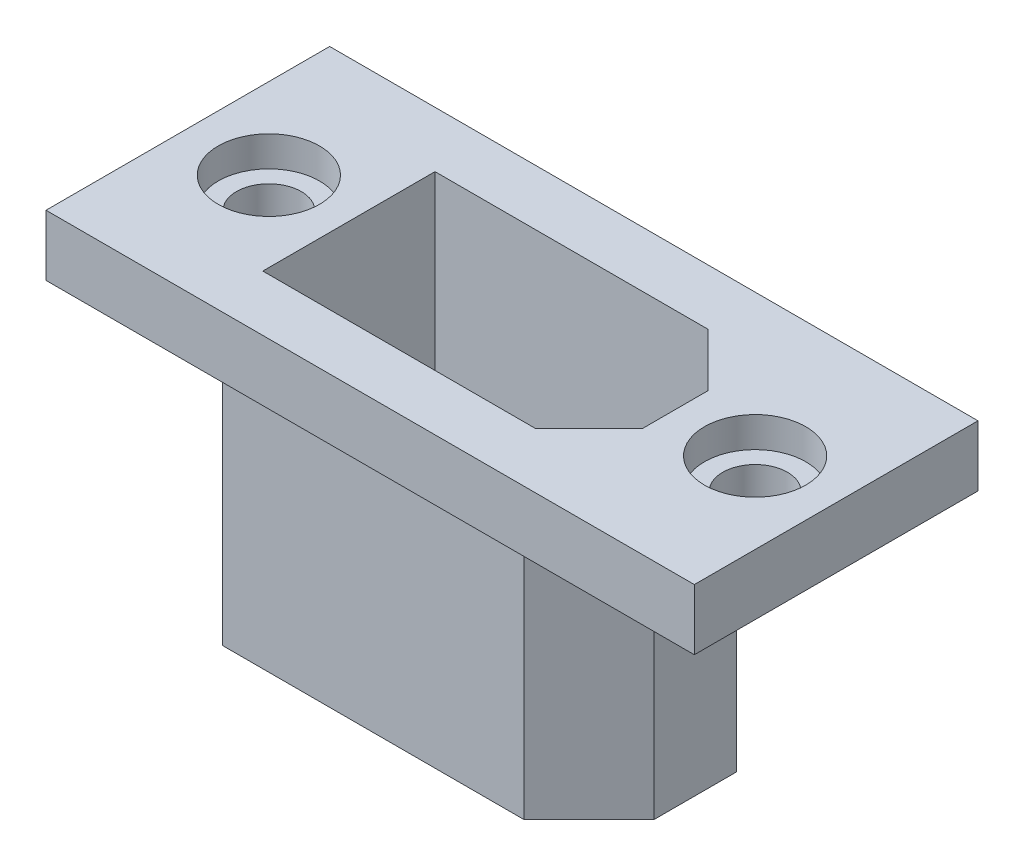
ISO-10303-21;
HEADER;
FILE_DESCRIPTION(('STEP AP214'),'2;1');
FILE_NAME('part.step','',(''),(''),'','','');
FILE_SCHEMA(('AUTOMOTIVE_DESIGN { 1 0 10303 214 1 1 1 1 }'));
ENDSEC;
DATA;
#1=APPLICATION_CONTEXT('core data for automotive mechanical design processes');
#2=APPLICATION_PROTOCOL_DEFINITION('international standard','automotive_design',2000,#1);
#3=PRODUCT_CONTEXT('',#1,'mechanical');
#4=PRODUCT('Part','Part','',(#3));
#5=PRODUCT_RELATED_PRODUCT_CATEGORY('part','',(#4));
#6=PRODUCT_DEFINITION_FORMATION('','',#4);
#7=PRODUCT_DEFINITION_CONTEXT('part definition',#1,'design');
#8=PRODUCT_DEFINITION('design','',#6,#7);
#9=PRODUCT_DEFINITION_SHAPE('','',#8);
#10=(LENGTH_UNIT() NAMED_UNIT(*) SI_UNIT(.MILLI.,.METRE.));
#11=(NAMED_UNIT(*) PLANE_ANGLE_UNIT() SI_UNIT($,.RADIAN.));
#12=(NAMED_UNIT(*) SI_UNIT($,.STERADIAN.) SOLID_ANGLE_UNIT());
#13=UNCERTAINTY_MEASURE_WITH_UNIT(LENGTH_MEASURE(1.E-05),#10,'distance_accuracy_value','');
#14=(GEOMETRIC_REPRESENTATION_CONTEXT(3) GLOBAL_UNCERTAINTY_ASSIGNED_CONTEXT((#13)) GLOBAL_UNIT_ASSIGNED_CONTEXT((#10,
#11,#12)) REPRESENTATION_CONTEXT('',''));
#15=CARTESIAN_POINT('',(0.,0.,0.));
#16=DIRECTION('',(0.,0.,1.));
#17=DIRECTION('',(1.,0.,0.));
#18=AXIS2_PLACEMENT_3D('',#15,#16,#17);
#19=CARTESIAN_POINT('',(12.,0.,0.));
#20=DIRECTION('',(0.,1.,0.));
#21=DIRECTION('',(0.,0.,1.));
#22=AXIS2_PLACEMENT_3D('',#19,#20,#21);
#23=CYLINDRICAL_SURFACE('',#22,1.6);
#24=CARTESIAN_POINT('',(12.,0.,0.));
#25=DIRECTION('',(0.,1.,0.));
#26=DIRECTION('',(0.,0.,1.));
#27=AXIS2_PLACEMENT_3D('',#24,#25,#26);
#28=CIRCLE('',#27,1.6);
#29=CARTESIAN_POINT('',(12.,0.,1.6));
#30=VERTEX_POINT('',#29);
#31=EDGE_CURVE('E177',#30,#30,#28,.T.);
#32=ORIENTED_EDGE('',*,*,#31,.F.);
#33=EDGE_LOOP('',(#32));
#34=FACE_BOUND('',#33,.T.);
#35=CARTESIAN_POINT('',(12.,1.5,0.));
#36=DIRECTION('',(0.,1.,0.));
#37=DIRECTION('',(0.,0.,1.));
#38=AXIS2_PLACEMENT_3D('',#35,#36,#37);
#39=CIRCLE('',#38,1.6);
#40=CARTESIAN_POINT('',(12.,1.5,1.6));
#41=VERTEX_POINT('',#40);
#42=EDGE_CURVE('E38',#41,#41,#39,.F.);
#43=ORIENTED_EDGE('',*,*,#42,.F.);
#44=EDGE_LOOP('',(#43));
#45=FACE_BOUND('',#44,.T.);
#46=ADVANCED_FACE('F34',(#34,#45),#23,.F.);
#47=CARTESIAN_POINT('',(-12.,0.,0.));
#48=DIRECTION('',(0.,1.,0.));
#49=DIRECTION('',(0.,0.,1.));
#50=AXIS2_PLACEMENT_3D('',#47,#48,#49);
#51=CYLINDRICAL_SURFACE('',#50,1.6);
#52=CARTESIAN_POINT('',(-12.,0.,0.));
#53=DIRECTION('',(0.,1.,0.));
#54=DIRECTION('',(0.,0.,1.));
#55=AXIS2_PLACEMENT_3D('',#52,#53,#54);
#56=CIRCLE('',#55,1.6);
#57=CARTESIAN_POINT('',(-12.,0.,1.6));
#58=VERTEX_POINT('',#57);
#59=EDGE_CURVE('E174',#58,#58,#56,.T.);
#60=ORIENTED_EDGE('',*,*,#59,.F.);
#61=EDGE_LOOP('',(#60));
#62=FACE_BOUND('',#61,.T.);
#63=CARTESIAN_POINT('',(-12.,1.5,0.));
#64=DIRECTION('',(0.,1.,0.));
#65=DIRECTION('',(0.,0.,1.));
#66=AXIS2_PLACEMENT_3D('',#63,#64,#65);
#67=CIRCLE('',#66,1.6);
#68=CARTESIAN_POINT('',(-12.,1.5,1.6));
#69=VERTEX_POINT('',#68);
#70=EDGE_CURVE('E285',#69,#69,#67,.F.);
#71=ORIENTED_EDGE('',*,*,#70,.F.);
#72=EDGE_LOOP('',(#71));
#73=FACE_BOUND('',#72,.T.);
#74=ADVANCED_FACE('F341',(#62,#73),#51,.F.);
#75=CARTESIAN_POINT('',(16.,3.,-7.));
#76=DIRECTION('',(-1.,0.,0.));
#77=DIRECTION('',(0.,0.,1.));
#78=AXIS2_PLACEMENT_3D('',#75,#76,#77);
#79=PLANE('',#78);
#80=DIRECTION('',(0.,0.,-1.));
#81=VECTOR('',#80,1.);
#82=CARTESIAN_POINT('',(16.,0.,-7.));
#83=LINE('',#82,#81);
#84=CARTESIAN_POINT('',(16.,0.,7.));
#85=VERTEX_POINT('',#84);
#86=CARTESIAN_POINT('',(16.,0.,-7.));
#87=VERTEX_POINT('',#86);
#88=EDGE_CURVE('E157',#85,#87,#83,.T.);
#89=ORIENTED_EDGE('',*,*,#88,.T.);
#90=DIRECTION('',(0.,-1.,0.));
#91=VECTOR('',#90,1.);
#92=CARTESIAN_POINT('',(16.,3.,-7.));
#93=LINE('',#92,#91);
#94=CARTESIAN_POINT('',(16.,3.,-7.));
#95=VERTEX_POINT('',#94);
#96=EDGE_CURVE('E269',#95,#87,#93,.T.);
#97=ORIENTED_EDGE('',*,*,#96,.F.);
#98=DIRECTION('',(0.,0.,-1.));
#99=VECTOR('',#98,1.);
#100=CARTESIAN_POINT('',(16.,3.,-7.));
#101=LINE('',#100,#99);
#102=CARTESIAN_POINT('',(16.,3.,7.));
#103=VERTEX_POINT('',#102);
#104=EDGE_CURVE('E243',#103,#95,#101,.T.);
#105=ORIENTED_EDGE('',*,*,#104,.F.);
#106=DIRECTION('',(0.,-1.,0.));
#107=VECTOR('',#106,1.);
#108=CARTESIAN_POINT('',(16.,3.,7.));
#109=LINE('',#108,#107);
#110=EDGE_CURVE('E253',#103,#85,#109,.T.);
#111=ORIENTED_EDGE('',*,*,#110,.T.);
#112=EDGE_LOOP('',(#89,#97,#105,#111));
#113=FACE_BOUND('',#112,.T.);
#114=ADVANCED_FACE('F36',(#113),#79,.F.);
#115=CARTESIAN_POINT('',(-16.,3.,-7.));
#116=DIRECTION('',(0.,0.,1.));
#117=DIRECTION('',(1.,0.,0.));
#118=AXIS2_PLACEMENT_3D('',#115,#116,#117);
#119=PLANE('',#118);
#120=DIRECTION('',(-1.,0.,0.));
#121=VECTOR('',#120,1.);
#122=CARTESIAN_POINT('',(-16.,0.,-7.));
#123=LINE('',#122,#121);
#124=CARTESIAN_POINT('',(-16.,0.,-7.));
#125=VERTEX_POINT('',#124);
#126=EDGE_CURVE('E256',#87,#125,#123,.T.);
#127=ORIENTED_EDGE('',*,*,#126,.T.);
#128=DIRECTION('',(0.,-1.,0.));
#129=VECTOR('',#128,1.);
#130=CARTESIAN_POINT('',(-16.,3.,-7.));
#131=LINE('',#130,#129);
#132=CARTESIAN_POINT('',(-16.,3.,-7.));
#133=VERTEX_POINT('',#132);
#134=EDGE_CURVE('E266',#133,#125,#131,.T.);
#135=ORIENTED_EDGE('',*,*,#134,.F.);
#136=DIRECTION('',(-1.,0.,0.));
#137=VECTOR('',#136,1.);
#138=CARTESIAN_POINT('',(-16.,3.,-7.));
#139=LINE('',#138,#137);
#140=EDGE_CURVE('E246',#95,#133,#139,.T.);
#141=ORIENTED_EDGE('',*,*,#140,.F.);
#142=ORIENTED_EDGE('',*,*,#96,.T.);
#143=EDGE_LOOP('',(#127,#135,#141,#142));
#144=FACE_BOUND('',#143,.T.);
#145=ADVANCED_FACE('F406',(#144),#119,.F.);
#146=CARTESIAN_POINT('',(-16.,3.,-7.));
#147=DIRECTION('',(1.,0.,0.));
#148=DIRECTION('',(0.,0.,-1.));
#149=AXIS2_PLACEMENT_3D('',#146,#147,#148);
#150=PLANE('',#149);
#151=DIRECTION('',(0.,0.,1.));
#152=VECTOR('',#151,1.);
#153=CARTESIAN_POINT('',(-16.,0.,-7.));
#154=LINE('',#153,#152);
#155=CARTESIAN_POINT('',(-16.,0.,7.));
#156=VERTEX_POINT('',#155);
#157=EDGE_CURVE('E258',#125,#156,#154,.T.);
#158=ORIENTED_EDGE('',*,*,#157,.T.);
#159=DIRECTION('',(0.,-1.,0.));
#160=VECTOR('',#159,1.);
#161=CARTESIAN_POINT('',(-16.,3.,7.));
#162=LINE('',#161,#160);
#163=CARTESIAN_POINT('',(-16.,3.,7.));
#164=VERTEX_POINT('',#163);
#165=EDGE_CURVE('E263',#164,#156,#162,.T.);
#166=ORIENTED_EDGE('',*,*,#165,.F.);
#167=DIRECTION('',(0.,0.,1.));
#168=VECTOR('',#167,1.);
#169=CARTESIAN_POINT('',(-16.,3.,-7.));
#170=LINE('',#169,#168);
#171=EDGE_CURVE('E249',#133,#164,#170,.T.);
#172=ORIENTED_EDGE('',*,*,#171,.F.);
#173=ORIENTED_EDGE('',*,*,#134,.T.);
#174=EDGE_LOOP('',(#158,#166,#172,#173));
#175=FACE_BOUND('',#174,.T.);
#176=ADVANCED_FACE('F403',(#175),#150,.F.);
#177=CARTESIAN_POINT('',(-16.,3.,7.));
#178=DIRECTION('',(0.,0.,-1.));
#179=DIRECTION('',(-1.,0.,0.));
#180=AXIS2_PLACEMENT_3D('',#177,#178,#179);
#181=PLANE('',#180);
#182=DIRECTION('',(1.,0.,0.));
#183=VECTOR('',#182,1.);
#184=CARTESIAN_POINT('',(-16.,0.,7.));
#185=LINE('',#184,#183);
#186=EDGE_CURVE('E247',#156,#85,#185,.T.);
#187=ORIENTED_EDGE('',*,*,#186,.T.);
#188=ORIENTED_EDGE('',*,*,#110,.F.);
#189=DIRECTION('',(1.,0.,0.));
#190=VECTOR('',#189,1.);
#191=CARTESIAN_POINT('',(-16.,3.,7.));
#192=LINE('',#191,#190);
#193=EDGE_CURVE('E251',#164,#103,#192,.T.);
#194=ORIENTED_EDGE('',*,*,#193,.F.);
#195=ORIENTED_EDGE('',*,*,#165,.T.);
#196=EDGE_LOOP('',(#187,#188,#194,#195));
#197=FACE_BOUND('',#196,.T.);
#198=ADVANCED_FACE('F312',(#197),#181,.F.);
#199=CARTESIAN_POINT('',(0.,3.,0.));
#200=DIRECTION('',(0.,1.,0.));
#201=DIRECTION('',(0.,0.,1.));
#202=AXIS2_PLACEMENT_3D('',#199,#200,#201);
#203=PLANE('',#202);
#204=CARTESIAN_POINT('',(-12.,3.,0.));
#205=DIRECTION('',(0.,1.,0.));
#206=DIRECTION('',(0.,0.,1.));
#207=AXIS2_PLACEMENT_3D('',#204,#205,#206);
#208=CIRCLE('',#207,2.5);
#209=CARTESIAN_POINT('',(-12.,3.,2.5));
#210=VERTEX_POINT('',#209);
#211=EDGE_CURVE('E292',#210,#210,#208,.T.);
#212=ORIENTED_EDGE('',*,*,#211,.F.);
#213=EDGE_LOOP('',(#212));
#214=FACE_BOUND('',#213,.T.);
#215=CARTESIAN_POINT('',(12.,3.,0.));
#216=DIRECTION('',(0.,1.,0.));
#217=DIRECTION('',(0.,0.,1.));
#218=AXIS2_PLACEMENT_3D('',#215,#216,#217);
#219=CIRCLE('',#218,2.5);
#220=CARTESIAN_POINT('',(12.,3.,2.5));
#221=VERTEX_POINT('',#220);
#222=EDGE_CURVE('E302',#221,#221,#219,.T.);
#223=ORIENTED_EDGE('',*,*,#222,.F.);
#224=EDGE_LOOP('',(#223));
#225=FACE_BOUND('',#224,.T.);
#226=ORIENTED_EDGE('',*,*,#104,.T.);
#227=ORIENTED_EDGE('',*,*,#140,.T.);
#228=ORIENTED_EDGE('',*,*,#171,.T.);
#229=ORIENTED_EDGE('',*,*,#193,.T.);
#230=EDGE_LOOP('',(#226,#227,#228,#229));
#231=FACE_BOUND('',#230,.T.);
#232=DIRECTION('',(0.707106781186548,0.,-0.707106781186547));
#233=VECTOR('',#232,1.);
#234=CARTESIAN_POINT('',(8.04999999999992,3.,1.62426406871191));
#235=LINE('',#234,#233);
#236=CARTESIAN_POINT('',(5.42426406871184,3.,4.24999999999998));
#237=VERTEX_POINT('',#236);
#238=CARTESIAN_POINT('',(8.04999999999992,3.,1.62426406871191));
#239=VERTEX_POINT('',#238);
#240=EDGE_CURVE('E59',#237,#239,#235,.T.);
#241=ORIENTED_EDGE('',*,*,#240,.F.);
#242=DIRECTION('',(1.,0.,0.));
#243=VECTOR('',#242,1.);
#244=CARTESIAN_POINT('',(5.42426406871184,3.,4.24999999999998));
#245=LINE('',#244,#243);
#246=CARTESIAN_POINT('',(-8.05000000000008,3.,4.24999999999998));
#247=VERTEX_POINT('',#246);
#248=EDGE_CURVE('E156',#247,#237,#245,.T.);
#249=ORIENTED_EDGE('',*,*,#248,.F.);
#250=DIRECTION('',(0.,0.,1.));
#251=VECTOR('',#250,1.);
#252=CARTESIAN_POINT('',(-8.05000000000008,3.,4.24999999999998));
#253=LINE('',#252,#251);
#254=CARTESIAN_POINT('',(-8.05000000000008,3.,-4.25000000000002));
#255=VERTEX_POINT('',#254);
#256=EDGE_CURVE('E231',#255,#247,#253,.T.);
#257=ORIENTED_EDGE('',*,*,#256,.F.);
#258=DIRECTION('',(-1.,0.,0.));
#259=VECTOR('',#258,1.);
#260=CARTESIAN_POINT('',(-8.05000000000008,3.,-4.25000000000002));
#261=LINE('',#260,#259);
#262=CARTESIAN_POINT('',(5.42426406871185,3.,-4.25000000000002));
#263=VERTEX_POINT('',#262);
#264=EDGE_CURVE('E228',#263,#255,#261,.T.);
#265=ORIENTED_EDGE('',*,*,#264,.F.);
#266=DIRECTION('',(-0.707106781186547,0.,-0.707106781186548));
#267=VECTOR('',#266,1.);
#268=CARTESIAN_POINT('',(5.42426406871185,3.,-4.25000000000002));
#269=LINE('',#268,#267);
#270=CARTESIAN_POINT('',(8.04999999999992,3.,-1.62426406871195));
#271=VERTEX_POINT('',#270);
#272=EDGE_CURVE('E225',#271,#263,#269,.T.);
#273=ORIENTED_EDGE('',*,*,#272,.F.);
#274=DIRECTION('',(0.,0.,-1.));
#275=VECTOR('',#274,1.);
#276=CARTESIAN_POINT('',(8.04999999999992,3.,-1.62426406871195));
#277=LINE('',#276,#275);
#278=EDGE_CURVE('E222',#239,#271,#277,.T.);
#279=ORIENTED_EDGE('',*,*,#278,.F.);
#280=EDGE_LOOP('',(#241,#249,#257,#265,#273,#279));
#281=FACE_BOUND('',#280,.T.);
#282=ADVANCED_FACE('F308',(#214,#225,#231,#281),#203,.T.);
#283=CARTESIAN_POINT('',(0.,0.,0.));
#284=DIRECTION('',(0.,1.,0.));
#285=DIRECTION('',(0.,0.,1.));
#286=AXIS2_PLACEMENT_3D('',#283,#284,#285);
#287=PLANE('',#286);
#288=ORIENTED_EDGE('',*,*,#59,.T.);
#289=EDGE_LOOP('',(#288));
#290=FACE_BOUND('',#289,.T.);
#291=ORIENTED_EDGE('',*,*,#31,.T.);
#292=EDGE_LOOP('',(#291));
#293=FACE_BOUND('',#292,.T.);
#294=DIRECTION('',(1.,0.,0.));
#295=VECTOR('',#294,1.);
#296=CARTESIAN_POINT('',(0.,0.,5.24999999999998));
#297=LINE('',#296,#295);
#298=CARTESIAN_POINT('',(-9.05000000000009,0.,5.24999999999998));
#299=VERTEX_POINT('',#298);
#300=CARTESIAN_POINT('',(5.83847763108494,0.,5.24999999999998));
#301=VERTEX_POINT('',#300);
#302=EDGE_CURVE('E43',#299,#301,#297,.T.);
#303=ORIENTED_EDGE('',*,*,#302,.T.);
#304=DIRECTION('',(0.707106781186548,0.,-0.707106781186548));
#305=VECTOR('',#304,1.);
#306=CARTESIAN_POINT('',(5.54423881554246,0.,5.54423881554246));
#307=LINE('',#306,#305);
#308=CARTESIAN_POINT('',(9.04999999999992,0.,2.03847763108501));
#309=VERTEX_POINT('',#308);
#310=EDGE_CURVE('E11',#301,#309,#307,.T.);
#311=ORIENTED_EDGE('',*,*,#310,.T.);
#312=DIRECTION('',(0.,0.,-1.));
#313=VECTOR('',#312,1.);
#314=CARTESIAN_POINT('',(9.04999999999992,0.,0.));
#315=LINE('',#314,#313);
#316=CARTESIAN_POINT('',(9.04999999999992,0.,-2.03847763108504));
#317=VERTEX_POINT('',#316);
#318=EDGE_CURVE('E272',#309,#317,#315,.T.);
#319=ORIENTED_EDGE('',*,*,#318,.T.);
#320=DIRECTION('',(-0.707106781186548,0.,-0.707106781186548));
#321=VECTOR('',#320,1.);
#322=CARTESIAN_POINT('',(5.54423881554248,0.,-5.54423881554248));
#323=LINE('',#322,#321);
#324=CARTESIAN_POINT('',(5.83847763108494,0.,-5.25000000000002));
#325=VERTEX_POINT('',#324);
#326=EDGE_CURVE('E275',#317,#325,#323,.T.);
#327=ORIENTED_EDGE('',*,*,#326,.T.);
#328=DIRECTION('',(-1.,0.,0.));
#329=VECTOR('',#328,1.);
#330=CARTESIAN_POINT('',(0.,0.,-5.25000000000002));
#331=LINE('',#330,#329);
#332=CARTESIAN_POINT('',(-9.05000000000009,0.,-5.25000000000002));
#333=VERTEX_POINT('',#332);
#334=EDGE_CURVE('E278',#325,#333,#331,.T.);
#335=ORIENTED_EDGE('',*,*,#334,.T.);
#336=DIRECTION('',(0.,0.,1.));
#337=VECTOR('',#336,1.);
#338=CARTESIAN_POINT('',(-9.05000000000009,0.,0.));
#339=LINE('',#338,#337);
#340=EDGE_CURVE('E281',#333,#299,#339,.T.);
#341=ORIENTED_EDGE('',*,*,#340,.T.);
#342=EDGE_LOOP('',(#303,#311,#319,#327,#335,#341));
#343=FACE_BOUND('',#342,.T.);
#344=ORIENTED_EDGE('',*,*,#88,.F.);
#345=ORIENTED_EDGE('',*,*,#186,.F.);
#346=ORIENTED_EDGE('',*,*,#157,.F.);
#347=ORIENTED_EDGE('',*,*,#126,.F.);
#348=EDGE_LOOP('',(#344,#345,#346,#347));
#349=FACE_BOUND('',#348,.T.);
#350=ADVANCED_FACE('F311',(#290,#293,#343,#349),#287,.F.);
#351=CARTESIAN_POINT('',(8.04999999999992,0.,1.62426406871191));
#352=DIRECTION('',(0.707106781186547,0.,0.707106781186548));
#353=DIRECTION('',(0.707106781186548,0.,-0.707106781186547));
#354=AXIS2_PLACEMENT_3D('',#351,#352,#353);
#355=PLANE('',#354);
#356=ORIENTED_EDGE('',*,*,#240,.T.);
#357=DIRECTION('',(0.,1.,0.));
#358=VECTOR('',#357,1.);
#359=CARTESIAN_POINT('',(8.04999999999992,0.,1.62426406871191));
#360=LINE('',#359,#358);
#361=CARTESIAN_POINT('',(8.04999999999992,-13.,1.62426406871191));
#362=VERTEX_POINT('',#361);
#363=EDGE_CURVE('E163',#362,#239,#360,.T.);
#364=ORIENTED_EDGE('',*,*,#363,.F.);
#365=DIRECTION('',(0.707106781186548,0.,-0.707106781186547));
#366=VECTOR('',#365,1.);
#367=CARTESIAN_POINT('',(8.04999999999992,-13.,1.62426406871191));
#368=LINE('',#367,#366);
#369=CARTESIAN_POINT('',(5.42426406871184,-13.,4.24999999999998));
#370=VERTEX_POINT('',#369);
#371=EDGE_CURVE('E161',#370,#362,#368,.T.);
#372=ORIENTED_EDGE('',*,*,#371,.F.);
#373=DIRECTION('',(0.,1.,0.));
#374=VECTOR('',#373,1.);
#375=CARTESIAN_POINT('',(5.42426406871184,0.,4.24999999999998));
#376=LINE('',#375,#374);
#377=EDGE_CURVE('E149',#370,#237,#376,.T.);
#378=ORIENTED_EDGE('',*,*,#377,.T.);
#379=EDGE_LOOP('',(#356,#364,#372,#378));
#380=FACE_BOUND('',#379,.T.);
#381=ADVANCED_FACE('F162',(#380),#355,.F.);
#382=CARTESIAN_POINT('',(5.42426406871184,0.,4.24999999999998));
#383=DIRECTION('',(0.,0.,1.));
#384=DIRECTION('',(1.,0.,0.));
#385=AXIS2_PLACEMENT_3D('',#382,#383,#384);
#386=PLANE('',#385);
#387=ORIENTED_EDGE('',*,*,#248,.T.);
#388=ORIENTED_EDGE('',*,*,#377,.F.);
#389=DIRECTION('',(1.,0.,0.));
#390=VECTOR('',#389,1.);
#391=CARTESIAN_POINT('',(5.42426406871184,-13.,4.24999999999998));
#392=LINE('',#391,#390);
#393=CARTESIAN_POINT('',(-8.05000000000008,-13.,4.24999999999998));
#394=VERTEX_POINT('',#393);
#395=EDGE_CURVE('E153',#394,#370,#392,.T.);
#396=ORIENTED_EDGE('',*,*,#395,.F.);
#397=DIRECTION('',(0.,1.,0.));
#398=VECTOR('',#397,1.);
#399=CARTESIAN_POINT('',(-8.05000000000008,0.,4.24999999999998));
#400=LINE('',#399,#398);
#401=EDGE_CURVE('E158',#394,#247,#400,.T.);
#402=ORIENTED_EDGE('',*,*,#401,.T.);
#403=EDGE_LOOP('',(#387,#388,#396,#402));
#404=FACE_BOUND('',#403,.T.);
#405=ADVANCED_FACE('F151',(#404),#386,.F.);
#406=CARTESIAN_POINT('',(-8.05000000000008,0.,4.24999999999998));
#407=DIRECTION('',(-1.,0.,0.));
#408=DIRECTION('',(0.,0.,1.));
#409=AXIS2_PLACEMENT_3D('',#406,#407,#408);
#410=PLANE('',#409);
#411=ORIENTED_EDGE('',*,*,#256,.T.);
#412=ORIENTED_EDGE('',*,*,#401,.F.);
#413=DIRECTION('',(0.,0.,1.));
#414=VECTOR('',#413,1.);
#415=CARTESIAN_POINT('',(-8.05000000000008,-13.,4.24999999999998));
#416=LINE('',#415,#414);
#417=CARTESIAN_POINT('',(-8.05000000000008,-13.,-4.25000000000002));
#418=VERTEX_POINT('',#417);
#419=EDGE_CURVE('E173',#418,#394,#416,.T.);
#420=ORIENTED_EDGE('',*,*,#419,.F.);
#421=DIRECTION('',(0.,1.,0.));
#422=VECTOR('',#421,1.);
#423=CARTESIAN_POINT('',(-8.05000000000008,0.,-4.25000000000002));
#424=LINE('',#423,#422);
#425=EDGE_CURVE('E236',#418,#255,#424,.T.);
#426=ORIENTED_EDGE('',*,*,#425,.T.);
#427=EDGE_LOOP('',(#411,#412,#420,#426));
#428=FACE_BOUND('',#427,.T.);
#429=ADVANCED_FACE('F331',(#428),#410,.F.);
#430=CARTESIAN_POINT('',(-8.05000000000008,0.,-4.25000000000002));
#431=DIRECTION('',(0.,0.,-1.));
#432=DIRECTION('',(-1.,0.,0.));
#433=AXIS2_PLACEMENT_3D('',#430,#431,#432);
#434=PLANE('',#433);
#435=ORIENTED_EDGE('',*,*,#264,.T.);
#436=ORIENTED_EDGE('',*,*,#425,.F.);
#437=DIRECTION('',(-1.,0.,0.));
#438=VECTOR('',#437,1.);
#439=CARTESIAN_POINT('',(-8.05000000000008,-13.,-4.25000000000002));
#440=LINE('',#439,#438);
#441=CARTESIAN_POINT('',(5.42426406871185,-13.,-4.25000000000002));
#442=VERTEX_POINT('',#441);
#443=EDGE_CURVE('E185',#442,#418,#440,.T.);
#444=ORIENTED_EDGE('',*,*,#443,.F.);
#445=DIRECTION('',(0.,1.,0.));
#446=VECTOR('',#445,1.);
#447=CARTESIAN_POINT('',(5.42426406871185,0.,-4.25000000000002));
#448=LINE('',#447,#446);
#449=EDGE_CURVE('E238',#442,#263,#448,.T.);
#450=ORIENTED_EDGE('',*,*,#449,.T.);
#451=EDGE_LOOP('',(#435,#436,#444,#450));
#452=FACE_BOUND('',#451,.T.);
#453=ADVANCED_FACE('F329',(#452),#434,.F.);
#454=CARTESIAN_POINT('',(5.42426406871185,0.,-4.25000000000002));
#455=DIRECTION('',(0.707106781186548,0.,-0.707106781186547));
#456=DIRECTION('',(-0.707106781186547,0.,-0.707106781186548));
#457=AXIS2_PLACEMENT_3D('',#454,#455,#456);
#458=PLANE('',#457);
#459=ORIENTED_EDGE('',*,*,#272,.T.);
#460=ORIENTED_EDGE('',*,*,#449,.F.);
#461=DIRECTION('',(-0.707106781186547,0.,-0.707106781186548));
#462=VECTOR('',#461,1.);
#463=CARTESIAN_POINT('',(5.42426406871185,-13.,-4.25000000000002));
#464=LINE('',#463,#462);
#465=CARTESIAN_POINT('',(8.04999999999992,-13.,-1.62426406871195));
#466=VERTEX_POINT('',#465);
#467=EDGE_CURVE('E182',#466,#442,#464,.T.);
#468=ORIENTED_EDGE('',*,*,#467,.F.);
#469=DIRECTION('',(0.,1.,0.));
#470=VECTOR('',#469,1.);
#471=CARTESIAN_POINT('',(8.04999999999992,0.,-1.62426406871195));
#472=LINE('',#471,#470);
#473=EDGE_CURVE('E240',#466,#271,#472,.T.);
#474=ORIENTED_EDGE('',*,*,#473,.T.);
#475=EDGE_LOOP('',(#459,#460,#468,#474));
#476=FACE_BOUND('',#475,.T.);
#477=ADVANCED_FACE('F327',(#476),#458,.F.);
#478=CARTESIAN_POINT('',(8.04999999999992,0.,-1.62426406871195));
#479=DIRECTION('',(1.,0.,0.));
#480=DIRECTION('',(0.,0.,-1.));
#481=AXIS2_PLACEMENT_3D('',#478,#479,#480);
#482=PLANE('',#481);
#483=ORIENTED_EDGE('',*,*,#278,.T.);
#484=ORIENTED_EDGE('',*,*,#473,.F.);
#485=DIRECTION('',(0.,0.,-1.));
#486=VECTOR('',#485,1.);
#487=CARTESIAN_POINT('',(8.04999999999992,-13.,-1.62426406871195));
#488=LINE('',#487,#486);
#489=EDGE_CURVE('E167',#362,#466,#488,.T.);
#490=ORIENTED_EDGE('',*,*,#489,.F.);
#491=ORIENTED_EDGE('',*,*,#363,.T.);
#492=EDGE_LOOP('',(#483,#484,#490,#491));
#493=FACE_BOUND('',#492,.T.);
#494=ADVANCED_FACE('F323',(#493),#482,.F.);
#495=CARTESIAN_POINT('',(9.04999999999992,-13.,2.03847763108501));
#496=DIRECTION('',(0.707106781186547,0.,0.707106781186547));
#497=DIRECTION('',(0.707106781186548,0.,-0.707106781186548));
#498=AXIS2_PLACEMENT_3D('',#495,#496,#497);
#499=PLANE('',#498);
#500=ORIENTED_EDGE('',*,*,#310,.F.);
#501=DIRECTION('',(0.,1.,0.));
#502=VECTOR('',#501,1.);
#503=CARTESIAN_POINT('',(5.83847763108494,-13.,5.24999999999998));
#504=LINE('',#503,#502);
#505=CARTESIAN_POINT('',(5.83847763108494,-13.,5.24999999999998));
#506=VERTEX_POINT('',#505);
#507=EDGE_CURVE('E206',#506,#301,#504,.T.);
#508=ORIENTED_EDGE('',*,*,#507,.F.);
#509=DIRECTION('',(0.707106781186548,0.,-0.707106781186548));
#510=VECTOR('',#509,1.);
#511=CARTESIAN_POINT('',(9.04999999999992,-13.,2.03847763108501));
#512=LINE('',#511,#510);
#513=CARTESIAN_POINT('',(9.04999999999992,-13.,2.03847763108501));
#514=VERTEX_POINT('',#513);
#515=EDGE_CURVE('E188',#506,#514,#512,.T.);
#516=ORIENTED_EDGE('',*,*,#515,.T.);
#517=DIRECTION('',(0.,1.,0.));
#518=VECTOR('',#517,1.);
#519=CARTESIAN_POINT('',(9.04999999999992,-13.,2.03847763108501));
#520=LINE('',#519,#518);
#521=EDGE_CURVE('E205',#514,#309,#520,.T.);
#522=ORIENTED_EDGE('',*,*,#521,.T.);
#523=EDGE_LOOP('',(#500,#508,#516,#522));
#524=FACE_BOUND('',#523,.T.);
#525=ADVANCED_FACE('F361',(#524),#499,.T.);
#526=CARTESIAN_POINT('',(5.83847763108494,-13.,5.24999999999998));
#527=DIRECTION('',(0.,0.,1.));
#528=DIRECTION('',(1.,0.,0.));
#529=AXIS2_PLACEMENT_3D('',#526,#527,#528);
#530=PLANE('',#529);
#531=ORIENTED_EDGE('',*,*,#302,.F.);
#532=DIRECTION('',(0.,1.,0.));
#533=VECTOR('',#532,1.);
#534=CARTESIAN_POINT('',(-9.05000000000009,-13.,5.24999999999998));
#535=LINE('',#534,#533);
#536=CARTESIAN_POINT('',(-9.05000000000009,-13.,5.24999999999998));
#537=VERTEX_POINT('',#536);
#538=EDGE_CURVE('E209',#537,#299,#535,.T.);
#539=ORIENTED_EDGE('',*,*,#538,.F.);
#540=DIRECTION('',(1.,0.,0.));
#541=VECTOR('',#540,1.);
#542=CARTESIAN_POINT('',(5.83847763108494,-13.,5.24999999999998));
#543=LINE('',#542,#541);
#544=EDGE_CURVE('E202',#537,#506,#543,.T.);
#545=ORIENTED_EDGE('',*,*,#544,.T.);
#546=ORIENTED_EDGE('',*,*,#507,.T.);
#547=EDGE_LOOP('',(#531,#539,#545,#546));
#548=FACE_BOUND('',#547,.T.);
#549=ADVANCED_FACE('F357',(#548),#530,.T.);
#550=CARTESIAN_POINT('',(-9.05000000000009,-13.,5.24999999999998));
#551=DIRECTION('',(-1.,0.,0.));
#552=DIRECTION('',(0.,0.,1.));
#553=AXIS2_PLACEMENT_3D('',#550,#551,#552);
#554=PLANE('',#553);
#555=ORIENTED_EDGE('',*,*,#340,.F.);
#556=DIRECTION('',(0.,1.,0.));
#557=VECTOR('',#556,1.);
#558=CARTESIAN_POINT('',(-9.05000000000009,-13.,-5.25000000000002));
#559=LINE('',#558,#557);
#560=CARTESIAN_POINT('',(-9.05000000000009,-13.,-5.25000000000002));
#561=VERTEX_POINT('',#560);
#562=EDGE_CURVE('E212',#561,#333,#559,.T.);
#563=ORIENTED_EDGE('',*,*,#562,.F.);
#564=DIRECTION('',(0.,0.,1.));
#565=VECTOR('',#564,1.);
#566=CARTESIAN_POINT('',(-9.05000000000009,-13.,5.24999999999998));
#567=LINE('',#566,#565);
#568=EDGE_CURVE('E199',#561,#537,#567,.T.);
#569=ORIENTED_EDGE('',*,*,#568,.T.);
#570=ORIENTED_EDGE('',*,*,#538,.T.);
#571=EDGE_LOOP('',(#555,#563,#569,#570));
#572=FACE_BOUND('',#571,.T.);
#573=ADVANCED_FACE('F360',(#572),#554,.T.);
#574=CARTESIAN_POINT('',(-9.05000000000009,-13.,-5.25000000000002));
#575=DIRECTION('',(0.,0.,-1.));
#576=DIRECTION('',(-1.,0.,0.));
#577=AXIS2_PLACEMENT_3D('',#574,#575,#576);
#578=PLANE('',#577);
#579=ORIENTED_EDGE('',*,*,#334,.F.);
#580=DIRECTION('',(0.,1.,0.));
#581=VECTOR('',#580,1.);
#582=CARTESIAN_POINT('',(5.83847763108494,-13.,-5.25000000000002));
#583=LINE('',#582,#581);
#584=CARTESIAN_POINT('',(5.83847763108494,-13.,-5.25000000000002));
#585=VERTEX_POINT('',#584);
#586=EDGE_CURVE('E215',#585,#325,#583,.T.);
#587=ORIENTED_EDGE('',*,*,#586,.F.);
#588=DIRECTION('',(-1.,0.,0.));
#589=VECTOR('',#588,1.);
#590=CARTESIAN_POINT('',(-9.05000000000009,-13.,-5.25000000000002));
#591=LINE('',#590,#589);
#592=EDGE_CURVE('E196',#585,#561,#591,.T.);
#593=ORIENTED_EDGE('',*,*,#592,.T.);
#594=ORIENTED_EDGE('',*,*,#562,.T.);
#595=EDGE_LOOP('',(#579,#587,#593,#594));
#596=FACE_BOUND('',#595,.T.);
#597=ADVANCED_FACE('F365',(#596),#578,.T.);
#598=CARTESIAN_POINT('',(5.83847763108494,-13.,-5.25000000000002));
#599=DIRECTION('',(0.707106781186547,0.,-0.707106781186547));
#600=DIRECTION('',(-0.707106781186548,0.,-0.707106781186548));
#601=AXIS2_PLACEMENT_3D('',#598,#599,#600);
#602=PLANE('',#601);
#603=ORIENTED_EDGE('',*,*,#326,.F.);
#604=DIRECTION('',(0.,1.,0.));
#605=VECTOR('',#604,1.);
#606=CARTESIAN_POINT('',(9.04999999999992,-13.,-2.03847763108504));
#607=LINE('',#606,#605);
#608=CARTESIAN_POINT('',(9.04999999999992,-13.,-2.03847763108504));
#609=VERTEX_POINT('',#608);
#610=EDGE_CURVE('E51',#609,#317,#607,.T.);
#611=ORIENTED_EDGE('',*,*,#610,.F.);
#612=DIRECTION('',(-0.707106781186548,0.,-0.707106781186548));
#613=VECTOR('',#612,1.);
#614=CARTESIAN_POINT('',(5.83847763108494,-13.,-5.25000000000002));
#615=LINE('',#614,#613);
#616=EDGE_CURVE('E193',#609,#585,#615,.T.);
#617=ORIENTED_EDGE('',*,*,#616,.T.);
#618=ORIENTED_EDGE('',*,*,#586,.T.);
#619=EDGE_LOOP('',(#603,#611,#617,#618));
#620=FACE_BOUND('',#619,.T.);
#621=ADVANCED_FACE('F369',(#620),#602,.T.);
#622=CARTESIAN_POINT('',(9.04999999999992,-13.,-2.03847763108504));
#623=DIRECTION('',(1.,0.,0.));
#624=DIRECTION('',(0.,0.,-1.));
#625=AXIS2_PLACEMENT_3D('',#622,#623,#624);
#626=PLANE('',#625);
#627=ORIENTED_EDGE('',*,*,#318,.F.);
#628=ORIENTED_EDGE('',*,*,#521,.F.);
#629=DIRECTION('',(0.,0.,-1.));
#630=VECTOR('',#629,1.);
#631=CARTESIAN_POINT('',(9.04999999999992,-13.,-2.03847763108504));
#632=LINE('',#631,#630);
#633=EDGE_CURVE('E191',#514,#609,#632,.T.);
#634=ORIENTED_EDGE('',*,*,#633,.T.);
#635=ORIENTED_EDGE('',*,*,#610,.T.);
#636=EDGE_LOOP('',(#627,#628,#634,#635));
#637=FACE_BOUND('',#636,.T.);
#638=ADVANCED_FACE('F356',(#637),#626,.T.);
#639=CARTESIAN_POINT('',(0.,-13.,0.));
#640=DIRECTION('',(0.,1.,0.));
#641=DIRECTION('',(0.,0.,1.));
#642=AXIS2_PLACEMENT_3D('',#639,#640,#641);
#643=PLANE('',#642);
#644=ORIENTED_EDGE('',*,*,#419,.T.);
#645=ORIENTED_EDGE('',*,*,#395,.T.);
#646=ORIENTED_EDGE('',*,*,#371,.T.);
#647=ORIENTED_EDGE('',*,*,#489,.T.);
#648=ORIENTED_EDGE('',*,*,#467,.T.);
#649=ORIENTED_EDGE('',*,*,#443,.T.);
#650=EDGE_LOOP('',(#644,#645,#646,#647,#648,#649));
#651=FACE_BOUND('',#650,.T.);
#652=ORIENTED_EDGE('',*,*,#515,.F.);
#653=ORIENTED_EDGE('',*,*,#544,.F.);
#654=ORIENTED_EDGE('',*,*,#568,.F.);
#655=ORIENTED_EDGE('',*,*,#592,.F.);
#656=ORIENTED_EDGE('',*,*,#616,.F.);
#657=ORIENTED_EDGE('',*,*,#633,.F.);
#658=EDGE_LOOP('',(#652,#653,#654,#655,#656,#657));
#659=FACE_BOUND('',#658,.T.);
#660=ADVANCED_FACE('F169',(#651,#659),#643,.F.);
#661=CARTESIAN_POINT('',(-12.,1.5,0.));
#662=DIRECTION('',(0.,1.,0.));
#663=DIRECTION('',(0.,0.,1.));
#664=AXIS2_PLACEMENT_3D('',#661,#662,#663);
#665=PLANE('',#664);
#666=CARTESIAN_POINT('',(-12.,1.5,0.));
#667=DIRECTION('',(0.,1.,0.));
#668=DIRECTION('',(0.,0.,1.));
#669=AXIS2_PLACEMENT_3D('',#666,#667,#668);
#670=CIRCLE('',#669,2.5);
#671=CARTESIAN_POINT('',(-12.,1.5,2.5));
#672=VERTEX_POINT('',#671);
#673=EDGE_CURVE('E287',#672,#672,#670,.T.);
#674=ORIENTED_EDGE('',*,*,#673,.T.);
#675=EDGE_LOOP('',(#674));
#676=FACE_BOUND('',#675,.T.);
#677=ORIENTED_EDGE('',*,*,#70,.T.);
#678=EDGE_LOOP('',(#677));
#679=FACE_BOUND('',#678,.T.);
#680=ADVANCED_FACE('F355',(#676,#679),#665,.T.);
#681=CARTESIAN_POINT('',(-12.,1.5,0.));
#682=DIRECTION('',(0.,1.,0.));
#683=DIRECTION('',(0.,0.,1.));
#684=AXIS2_PLACEMENT_3D('',#681,#682,#683);
#685=CYLINDRICAL_SURFACE('',#684,2.5);
#686=ORIENTED_EDGE('',*,*,#673,.F.);
#687=EDGE_LOOP('',(#686));
#688=FACE_BOUND('',#687,.T.);
#689=ORIENTED_EDGE('',*,*,#211,.T.);
#690=EDGE_LOOP('',(#689));
#691=FACE_BOUND('',#690,.T.);
#692=ADVANCED_FACE('F495',(#688,#691),#685,.F.);
#693=CARTESIAN_POINT('',(12.,1.5,0.));
#694=DIRECTION('',(0.,1.,0.));
#695=DIRECTION('',(0.,0.,1.));
#696=AXIS2_PLACEMENT_3D('',#693,#694,#695);
#697=PLANE('',#696);
#698=CARTESIAN_POINT('',(12.,1.5,0.));
#699=DIRECTION('',(0.,1.,0.));
#700=DIRECTION('',(0.,0.,1.));
#701=AXIS2_PLACEMENT_3D('',#698,#699,#700);
#702=CIRCLE('',#701,2.5);
#703=CARTESIAN_POINT('',(12.,1.5,2.5));
#704=VERTEX_POINT('',#703);
#705=EDGE_CURVE('E297',#704,#704,#702,.T.);
#706=ORIENTED_EDGE('',*,*,#705,.T.);
#707=EDGE_LOOP('',(#706));
#708=FACE_BOUND('',#707,.T.);
#709=ORIENTED_EDGE('',*,*,#42,.T.);
#710=EDGE_LOOP('',(#709));
#711=FACE_BOUND('',#710,.T.);
#712=ADVANCED_FACE('F504',(#708,#711),#697,.T.);
#713=CARTESIAN_POINT('',(12.,1.5,0.));
#714=DIRECTION('',(0.,1.,0.));
#715=DIRECTION('',(0.,0.,1.));
#716=AXIS2_PLACEMENT_3D('',#713,#714,#715);
#717=CYLINDRICAL_SURFACE('',#716,2.5);
#718=ORIENTED_EDGE('',*,*,#705,.F.);
#719=EDGE_LOOP('',(#718));
#720=FACE_BOUND('',#719,.T.);
#721=ORIENTED_EDGE('',*,*,#222,.T.);
#722=EDGE_LOOP('',(#721));
#723=FACE_BOUND('',#722,.T.);
#724=ADVANCED_FACE('F306',(#720,#723),#717,.F.);
#725=CLOSED_SHELL('',(#46,#74,#114,#145,#176,#198,#282,#350,#381,#405,#429,#453,#477,#494,#525,
#549,#573,#597,#621,#638,#660,#680,#692,#712,#724));
#726=MANIFOLD_SOLID_BREP('B2',#725);
#727=ADVANCED_BREP_SHAPE_REPRESENTATION('',(#18,#726),#14);
#728=SHAPE_DEFINITION_REPRESENTATION(#9,#727);
ENDSEC;
END-ISO-10303-21;
